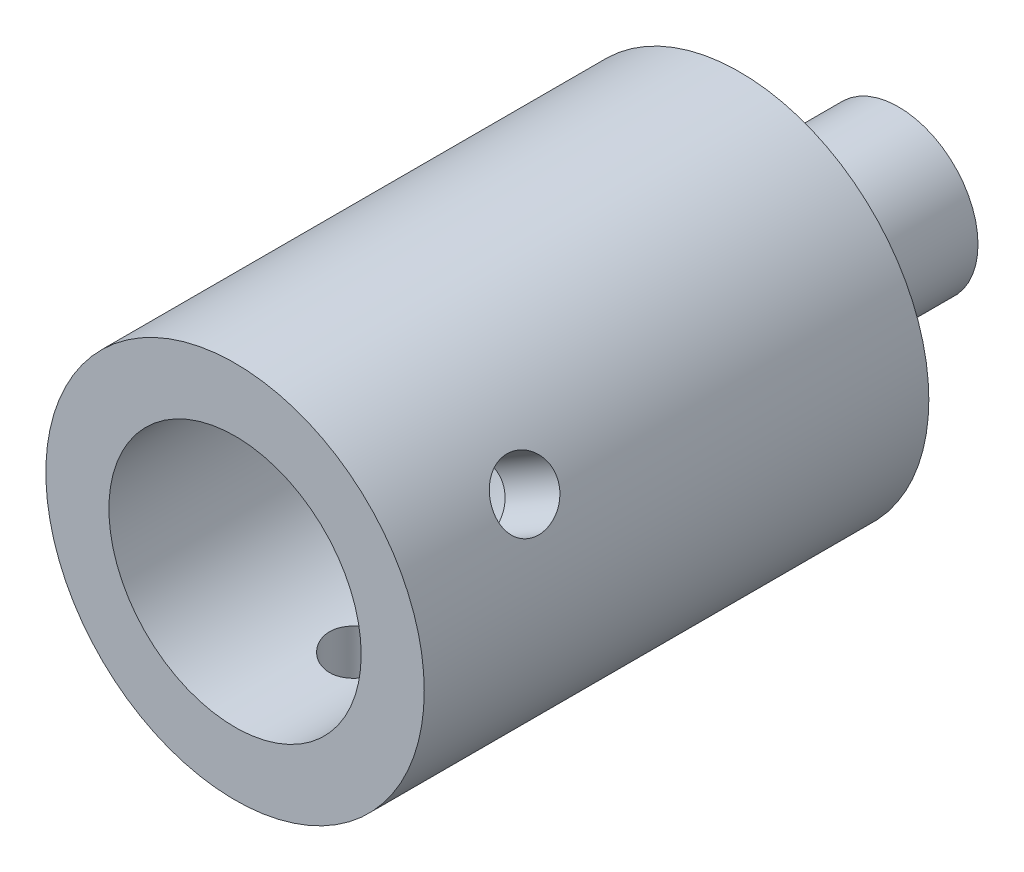
ISO-10303-21;
HEADER;
FILE_DESCRIPTION(('STEP AP214'),'2;1');
FILE_NAME('part.step','',(''),(''),'','','');
FILE_SCHEMA(('AUTOMOTIVE_DESIGN { 1 0 10303 214 1 1 1 1 }'));
ENDSEC;
DATA;
#1=APPLICATION_CONTEXT('core data for automotive mechanical design processes');
#2=APPLICATION_PROTOCOL_DEFINITION('international standard','automotive_design',2000,#1);
#3=PRODUCT_CONTEXT('',#1,'mechanical');
#4=PRODUCT('Part','Part','',(#3));
#5=PRODUCT_RELATED_PRODUCT_CATEGORY('part','',(#4));
#6=PRODUCT_DEFINITION_FORMATION('','',#4);
#7=PRODUCT_DEFINITION_CONTEXT('part definition',#1,'design');
#8=PRODUCT_DEFINITION('design','',#6,#7);
#9=PRODUCT_DEFINITION_SHAPE('','',#8);
#10=(LENGTH_UNIT() NAMED_UNIT(*) SI_UNIT(.MILLI.,.METRE.));
#11=(NAMED_UNIT(*) PLANE_ANGLE_UNIT() SI_UNIT($,.RADIAN.));
#12=(NAMED_UNIT(*) SI_UNIT($,.STERADIAN.) SOLID_ANGLE_UNIT());
#13=UNCERTAINTY_MEASURE_WITH_UNIT(LENGTH_MEASURE(1.E-05),#10,'distance_accuracy_value','');
#14=(GEOMETRIC_REPRESENTATION_CONTEXT(3) GLOBAL_UNCERTAINTY_ASSIGNED_CONTEXT((#13)) GLOBAL_UNIT_ASSIGNED_CONTEXT((#10,
#11,#12)) REPRESENTATION_CONTEXT('',''));
#15=CARTESIAN_POINT('',(0.,0.,0.));
#16=DIRECTION('',(0.,0.,1.));
#17=DIRECTION('',(1.,0.,0.));
#18=AXIS2_PLACEMENT_3D('',#15,#16,#17);
#19=CARTESIAN_POINT('',(0.,0.,7.));
#20=DIRECTION('',(0.,0.,-1.));
#21=DIRECTION('',(-1.,0.,0.));
#22=AXIS2_PLACEMENT_3D('',#19,#20,#21);
#23=CYLINDRICAL_SURFACE('',#22,4.);
#24=CARTESIAN_POINT('',(0.,0.,7.));
#25=DIRECTION('',(0.,0.,1.));
#26=DIRECTION('',(1.,0.,0.));
#27=AXIS2_PLACEMENT_3D('',#24,#25,#26);
#28=CIRCLE('',#27,4.);
#29=CARTESIAN_POINT('',(4.,0.,7.));
#30=VERTEX_POINT('',#29);
#31=EDGE_CURVE('E10',#30,#30,#28,.T.);
#32=ORIENTED_EDGE('',*,*,#31,.F.);
#33=EDGE_LOOP('',(#32));
#34=FACE_BOUND('',#33,.T.);
#35=CARTESIAN_POINT('',(0.,0.,0.));
#36=DIRECTION('',(0.,0.,1.));
#37=DIRECTION('',(1.,0.,0.));
#38=AXIS2_PLACEMENT_3D('',#35,#36,#37);
#39=CIRCLE('',#38,4.);
#40=CARTESIAN_POINT('',(4.,0.,0.));
#41=VERTEX_POINT('',#40);
#42=EDGE_CURVE('E43',#41,#41,#39,.T.);
#43=ORIENTED_EDGE('',*,*,#42,.T.);
#44=EDGE_LOOP('',(#43));
#45=FACE_BOUND('',#44,.T.);
#46=ADVANCED_FACE('F32',(#34,#45),#23,.T.);
#47=CARTESIAN_POINT('',(0.,0.,0.));
#48=DIRECTION('',(0.,0.,1.));
#49=DIRECTION('',(1.,0.,0.));
#50=AXIS2_PLACEMENT_3D('',#47,#48,#49);
#51=PLANE('',#50);
#52=ORIENTED_EDGE('',*,*,#42,.F.);
#53=EDGE_LOOP('',(#52));
#54=FACE_BOUND('',#53,.T.);
#55=ADVANCED_FACE('F118',(#54),#51,.F.);
#56=CARTESIAN_POINT('',(0.,0.,7.));
#57=DIRECTION('',(0.,0.,1.));
#58=DIRECTION('',(1.,0.,0.));
#59=AXIS2_PLACEMENT_3D('',#56,#57,#58);
#60=PLANE('',#59);
#61=CARTESIAN_POINT('',(0.,0.,7.));
#62=DIRECTION('',(0.,0.,1.));
#63=DIRECTION('',(1.,0.,0.));
#64=AXIS2_PLACEMENT_3D('',#61,#62,#63);
#65=CIRCLE('',#64,5.5);
#66=CARTESIAN_POINT('',(5.5,0.,7.));
#67=VERTEX_POINT('',#66);
#68=EDGE_CURVE('E51',#67,#67,#65,.T.);
#69=ORIENTED_EDGE('',*,*,#68,.F.);
#70=EDGE_LOOP('',(#69));
#71=FACE_BOUND('',#70,.T.);
#72=ORIENTED_EDGE('',*,*,#31,.T.);
#73=EDGE_LOOP('',(#72));
#74=FACE_BOUND('',#73,.T.);
#75=ADVANCED_FACE('F99',(#71,#74),#60,.F.);
#76=CARTESIAN_POINT('',(0.,0.,8.));
#77=DIRECTION('',(0.,0.,-1.));
#78=DIRECTION('',(-1.,0.,0.));
#79=AXIS2_PLACEMENT_3D('',#76,#77,#78);
#80=CYLINDRICAL_SURFACE('',#79,5.5);
#81=CARTESIAN_POINT('',(0.,0.,8.));
#82=DIRECTION('',(0.,0.,1.));
#83=DIRECTION('',(1.,0.,0.));
#84=AXIS2_PLACEMENT_3D('',#81,#82,#83);
#85=CIRCLE('',#84,5.5);
#86=CARTESIAN_POINT('',(5.5,0.,8.));
#87=VERTEX_POINT('',#86);
#88=EDGE_CURVE('E48',#87,#87,#85,.T.);
#89=ORIENTED_EDGE('',*,*,#88,.F.);
#90=EDGE_LOOP('',(#89));
#91=FACE_BOUND('',#90,.T.);
#92=ORIENTED_EDGE('',*,*,#68,.T.);
#93=EDGE_LOOP('',(#92));
#94=FACE_BOUND('',#93,.T.);
#95=ADVANCED_FACE('F129',(#91,#94),#80,.T.);
#96=CARTESIAN_POINT('',(0.,0.,8.));
#97=DIRECTION('',(0.,0.,1.));
#98=DIRECTION('',(1.,0.,0.));
#99=AXIS2_PLACEMENT_3D('',#96,#97,#98);
#100=PLANE('',#99);
#101=CARTESIAN_POINT('',(0.,0.,8.));
#102=DIRECTION('',(0.,0.,1.));
#103=DIRECTION('',(1.,0.,0.));
#104=AXIS2_PLACEMENT_3D('',#101,#102,#103);
#105=CIRCLE('',#104,9.525);
#106=CARTESIAN_POINT('',(9.525,0.,8.));
#107=VERTEX_POINT('',#106);
#108=EDGE_CURVE('E144',#107,#107,#105,.T.);
#109=ORIENTED_EDGE('',*,*,#108,.F.);
#110=EDGE_LOOP('',(#109));
#111=FACE_BOUND('',#110,.T.);
#112=ORIENTED_EDGE('',*,*,#88,.T.);
#113=EDGE_LOOP('',(#112));
#114=FACE_BOUND('',#113,.T.);
#115=ADVANCED_FACE('F97',(#111,#114),#100,.F.);
#116=CARTESIAN_POINT('',(0.,0.,33.4));
#117=DIRECTION('',(0.,0.,-1.));
#118=DIRECTION('',(-1.,0.,0.));
#119=AXIS2_PLACEMENT_3D('',#116,#117,#118);
#120=CYLINDRICAL_SURFACE('',#119,9.525);
#121=CARTESIAN_POINT('',(-7.3397671704804,6.07070365634315,27.05));
#122=CARTESIAN_POINT('',(-7.33977033253742,6.07070137468341,27.138503600082));
#123=CARTESIAN_POINT('',(-7.3445754385604,6.0649046536751,27.2270555298552));
#124=CARTESIAN_POINT('',(-7.36356918153057,6.04182825898946,27.4016747749723));
#125=CARTESIAN_POINT('',(-7.37776647198727,6.02453799564098,27.4877397225364));
#126=CARTESIAN_POINT('',(-7.41483371988077,5.97885650645414,27.6548325999219));
#127=CARTESIAN_POINT('',(-7.43769642884468,5.9504745580037,27.7358646739005));
#128=CARTESIAN_POINT('',(-7.49101992062327,5.88320315266951,27.8907279062458));
#129=CARTESIAN_POINT('',(-7.52147984837406,5.84431487822755,27.9645598736816));
#130=CARTESIAN_POINT('',(-7.58895019589476,5.75643526828001,28.1036636595878));
#131=CARTESIAN_POINT('',(-7.62601603702953,5.70735782459463,28.1688542084302));
#132=CARTESIAN_POINT('',(-7.70494556970601,5.60034380820746,28.2881187498572));
#133=CARTESIAN_POINT('',(-7.74680954538105,5.54240671079151,28.3421920835783));
#134=CARTESIAN_POINT('',(-7.83392365811389,5.41858106121126,28.4379922501842));
#135=CARTESIAN_POINT('',(-7.87919251789159,5.35264710528593,28.4796434499097));
#136=CARTESIAN_POINT('',(-7.97116359216357,5.21469462228451,28.5489308797869));
#137=CARTESIAN_POINT('',(-8.01786571325012,5.14267649118907,28.5765680212069));
#138=CARTESIAN_POINT('',(-8.11060378021907,4.99512270360019,28.6167942597148));
#139=CARTESIAN_POINT('',(-8.15664189612996,4.91962565126651,28.629519901663));
#140=CARTESIAN_POINT('',(-8.24700345620439,4.76659751131113,28.6399865038869));
#141=CARTESIAN_POINT('',(-8.29132701670939,4.68906656230106,28.637728482682));
#142=CARTESIAN_POINT('',(-8.37657675489082,4.53500436910733,28.6183983417796));
#143=CARTESIAN_POINT('',(-8.41753223408136,4.45847082911578,28.6014731712352));
#144=CARTESIAN_POINT('',(-8.49557927248539,4.30789439072605,28.5535205678535));
#145=CARTESIAN_POINT('',(-8.53267071397512,4.23385156825787,28.5224927055107));
#146=CARTESIAN_POINT('',(-8.60247587438793,4.09016498577646,28.4470694433998));
#147=CARTESIAN_POINT('',(-8.63516877292796,4.02054291840797,28.4026134923276));
#148=CARTESIAN_POINT('',(-8.6955551897074,3.88821848491557,28.3016403576267));
#149=CARTESIAN_POINT('',(-8.72324830298548,3.82551667946318,28.2451221978186));
#150=CARTESIAN_POINT('',(-8.77372026862784,3.70831312989371,28.1208139577967));
#151=CARTESIAN_POINT('',(-8.79643542484236,3.65392009825855,28.0528954447379));
#152=CARTESIAN_POINT('',(-8.83643731007603,3.5560937103181,27.9081471977129));
#153=CARTESIAN_POINT('',(-8.85372398902194,3.51266045510845,27.8313173815564));
#154=CARTESIAN_POINT('',(-8.88288588231045,3.4382510169371,27.6707813074078));
#155=CARTESIAN_POINT('',(-8.89475501375053,3.40728884124913,27.5870674437115));
#156=CARTESIAN_POINT('',(-8.91308271026492,3.35905549011894,27.4152208390847));
#157=CARTESIAN_POINT('',(-8.91954175174526,3.341783109177,27.3270884879654));
#158=CARTESIAN_POINT('',(-8.92703260494413,3.3217207520737,27.150033990837));
#159=CARTESIAN_POINT('',(-8.92812831416677,3.318760272504,27.0611338488892));
#160=CARTESIAN_POINT('',(-8.92507074617418,3.32697394821566,26.8840829634763));
#161=CARTESIAN_POINT('',(-8.92091767169842,3.33814755755383,26.7959321911986));
#162=CARTESIAN_POINT('',(-8.90738778555396,3.37408192338086,26.6234528729138));
#163=CARTESIAN_POINT('',(-8.89804418343364,3.39875628566325,26.5391036761775));
#164=CARTESIAN_POINT('',(-8.87412602657642,3.46072372637022,26.3759664444125));
#165=CARTESIAN_POINT('',(-8.85955115890975,3.49801755967295,26.2971787424052));
#166=CARTESIAN_POINT('',(-8.8249926609673,3.58431326542908,26.1466016325521));
#167=CARTESIAN_POINT('',(-8.80496038282067,3.63341995444791,26.0748834762999));
#168=CARTESIAN_POINT('',(-8.75958273057526,3.74149192437504,25.9412179067387));
#169=CARTESIAN_POINT('',(-8.73423698275104,3.80045789868183,25.8792711812453));
#170=CARTESIAN_POINT('',(-8.67808606314281,3.92699358708323,25.7662510481173));
#171=CARTESIAN_POINT('',(-8.64722685589621,3.99464640059104,25.7152974203093));
#172=CARTESIAN_POINT('',(-8.5805666663747,4.13589050400548,25.6265488673519));
#173=CARTESIAN_POINT('',(-8.54476584400326,4.20948160172589,25.5887535165591));
#174=CARTESIAN_POINT('',(-8.46897413203636,4.3599496640802,25.5275807791887));
#175=CARTESIAN_POINT('',(-8.42900236332594,4.43681075361013,25.5041407119083));
#176=CARTESIAN_POINT('',(-8.34561012473451,4.59174815004847,25.472142094658));
#177=CARTESIAN_POINT('',(-8.30218993892747,4.66982435643272,25.463582320205));
#178=CARTESIAN_POINT('',(-8.21360430735389,4.82391260757188,25.4616225047318));
#179=CARTESIAN_POINT('',(-8.16846634955245,4.89993819836631,25.4680402137474));
#180=CARTESIAN_POINT('',(-8.07732453399269,5.04876918342056,25.4954589906411));
#181=CARTESIAN_POINT('',(-8.03132068108442,5.12157459570965,25.5164599768586));
#182=CARTESIAN_POINT('',(-7.94003660117748,5.26198195091442,25.5723792351203));
#183=CARTESIAN_POINT('',(-7.89475562668802,5.32958958766377,25.6072820118136));
#184=CARTESIAN_POINT('',(-7.80648495249481,5.45806744609948,25.6899937895062));
#185=CARTESIAN_POINT('',(-7.76349536152267,5.5189373482116,25.7378034023137));
#186=CARTESIAN_POINT('',(-7.68096914241536,5.63323809012857,25.8456177837134));
#187=CARTESIAN_POINT('',(-7.64147772168657,5.68657570292672,25.9057560062706));
#188=CARTESIAN_POINT('',(-7.56812478582015,5.78384240490929,26.0362404755153));
#189=CARTESIAN_POINT('',(-7.53426459152374,5.82776928743931,26.1065891098961));
#190=CARTESIAN_POINT('',(-7.47344871519166,5.90556108086505,26.2560882797924));
#191=CARTESIAN_POINT('',(-7.44654356648653,5.93935262042107,26.3352975557973));
#192=CARTESIAN_POINT('',(-7.40124392822496,5.99570944693093,26.4998418648037));
#193=CARTESIAN_POINT('',(-7.38284093751907,6.01828594929884,26.5851706799121));
#194=CARTESIAN_POINT('',(-7.35942469895389,6.04687676634594,26.734026393618));
#195=CARTESIAN_POINT('',(-7.35207151958579,6.05580130455243,26.7966520230545));
#196=CARTESIAN_POINT('',(-7.34224166362754,6.06771551537862,26.9228434628732));
#197=CARTESIAN_POINT('',(-7.33976489851002,6.07070529573906,26.9864092561664));
#198=CARTESIAN_POINT('',(-7.3397671704804,6.07070365634315,27.05));
#199=B_SPLINE_CURVE_WITH_KNOTS('',3,(#121,#122,#123,#124,#125,#126,#127,#128,#129,#130,#131,
#132,#133,#134,#135,#136,#137,#138,#139,#140,#141,#142,#143,#144,#145,#146,#147,#148,#149,#150,
#151,#152,#153,#154,#155,#156,#157,#158,#159,#160,#161,#162,#163,#164,#165,#166,#167,#168,#169,
#170,#171,#172,#173,#174,#175,#176,#177,#178,#179,#180,#181,#182,#183,#184,#185,#186,#187,#188,
#189,#190,#191,#192,#193,#194,#195,#196,#197,#198),.UNSPECIFIED.,.T.,.F.,(4,2,2,2,2,2,2,2,2,2,2,
2,2,2,2,2,2,2,2,2,2,2,2,2,2,2,2,2,2,2,2,2,2,2,2,2,2,2,4),(0.,0.265278259719118,
0.530801275176487,0.796102673650743,1.06137422602349,1.32898616063879,1.59661395074874,
1.86583942370761,2.13504738795557,2.40177045345079,2.66847538854459,2.93253871939564,
3.19661009298453,3.46189048628535,3.72719235653995,3.99571288398448,4.26423588823722,
4.53305965686613,4.80185975070678,5.0674494943696,5.33302897967875,5.59692851043537,
5.8608438300642,6.12719337654316,6.39356166313487,6.66270011777466,6.93182986552703,
7.19977595105205,7.46769998654343,7.73238087928857,7.99706028993953,8.2614455029361,
8.52584325049132,8.79327043389165,9.0607602558995,9.33014217036923,9.59925414881156,
9.78986275793718,9.98046790668583),.UNSPECIFIED.);
#200=CARTESIAN_POINT('',(-7.3397671704804,6.07070365634315,27.05));
#201=VERTEX_POINT('',#200);
#202=EDGE_CURVE('E60',#201,#201,#199,.T.);
#203=ORIENTED_EDGE('',*,*,#202,.T.);
#204=EDGE_LOOP('',(#203));
#205=FACE_BOUND('',#204,.T.);
#206=CARTESIAN_POINT('',(8.92726717048046,3.32107299932744,27.05));
#207=CARTESIAN_POINT('',(8.92726677553368,3.32107687857902,27.138503600082));
#208=CARTESIAN_POINT('',(8.92464922089331,3.32813658296696,27.2270555298552));
#209=CARTESIAN_POINT('',(8.91416134835288,3.35612384423488,27.4016747749723));
#210=CARTESIAN_POINT('',(8.90628618628332,3.37706419010954,27.4877397225364));
#211=CARTESIAN_POINT('',(8.88525848011157,3.4320061130271,27.6548325999219));
#212=CARTESIAN_POINT('',(8.87211034622654,3.4659967740144,27.7358646739005));
#213=CARTESIAN_POINT('',(8.84051334614815,3.54581197518024,27.8907279062458));
#214=CARTESIAN_POINT('',(8.82206507644746,3.59163518363084,27.9645598736816));
#215=CARTESIAN_POINT('',(8.77969427551857,3.69400602355971,28.1036636595878));
#216=CARTESIAN_POINT('',(8.75572488310163,3.75064470543775,28.1688542084302));
#217=CARTESIAN_POINT('',(8.70251279268757,3.872506694038,28.2881187498572));
#218=CARTESIAN_POINT('',(8.67326978234134,3.93773050918397,28.3421920835783));
#219=CARTESIAN_POINT('',(8.60959068053116,4.07508636862888,28.4379922501842));
#220=CARTESIAN_POINT('',(8.57512462961667,4.14725732915939,28.4796434499097));
#221=CARTESIAN_POINT('',(8.50163981195829,4.29588285739298,28.5489308797869));
#222=CARTESIAN_POINT('',(8.46262134143983,4.37233714621227,28.5765680212069));
#223=CARTESIAN_POINT('',(8.38120504644773,4.52642756189968,28.6167942597148));
#224=CARTESIAN_POINT('',(8.33884173917136,4.60404626598773,28.629519901663));
#225=CARTESIAN_POINT('',(8.25149626251334,4.75881574251547,28.6399865038869));
#226=CARTESIAN_POINT('',(8.2065142713436,4.835966546404,28.637728482682));
#227=CARTESIAN_POINT('',(8.1157173673658,4.98682608193196,28.6183983417796));
#228=CARTESIAN_POINT('',(8.06991511708684,5.06056133733091,28.6014731712352));
#229=CARTESIAN_POINT('',(7.97853561543197,5.2034402744738,28.5535205678535));
#230=CARTESIAN_POINT('',(7.93295837095148,5.27258381630099,28.5224927055107));
#231=CARTESIAN_POINT('',(7.84342472054602,5.40488014977444,28.4470694433998));
#232=CARTESIAN_POINT('',(7.79947669081093,5.46800406411769,28.4026134923276));
#233=CARTESIAN_POINT('',(7.71507357825485,5.5864624518384,28.3016403576267));
#234=CARTESIAN_POINT('',(7.67461877850897,5.6417962941733,28.2451221978186));
#235=CARTESIAN_POINT('',(7.59835350998928,5.74410807338325,28.1208139577967));
#236=CARTESIAN_POINT('',(7.56260534091165,5.79097649153354,28.0528954447379));
#237=CARTESIAN_POINT('',(7.49788614641158,5.87453233431539,27.9081471977129));
#238=CARTESIAN_POINT('',(7.46891518350392,5.91121966503443,27.8313173815564));
#239=CARTESIAN_POINT('',(7.41905566641046,5.97367932453041,27.6707813074078));
#240=CARTESIAN_POINT('',(7.39817620142828,5.99943938172236,27.5870674437115));
#241=CARTESIAN_POINT('',(7.36556874229707,6.03942830806177,27.4152208390847));
#242=CARTESIAN_POINT('',(7.35383994235768,6.05365819253882,27.3270884879654));
#243=CARTESIAN_POINT('',(7.34021085804587,6.07017664025671,27.150033990837));
#244=CARTESIAN_POINT('',(7.33819486214244,6.07260579206352,27.0611338488892));
#245=CARTESIAN_POINT('',(7.34377932997089,6.06585102265231,26.8840829634763));
#246=CARTESIAN_POINT('',(7.35137942227184,6.05666754998341,26.7959321911986));
#247=CARTESIAN_POINT('',(7.37573455287469,6.02698314195848,26.6234528729138));
#248=CARTESIAN_POINT('',(7.39243137637326,6.00655416401824,26.5391036761775));
#249=CARTESIAN_POINT('',(7.43413767580439,5.95485671221469,26.3759664444125));
#250=CARTESIAN_POINT('',(7.45914764901573,5.9235875899072,26.2971787424052));
#251=CARTESIAN_POINT('',(7.51660267346682,5.85051119989434,26.1466016325521));
#252=CARTESIAN_POINT('',(7.54911417457955,5.80860939361427,26.0748834762999));
#253=CARTESIAN_POINT('',(7.62001841985077,5.71527520904208,25.9412179067387));
#254=CARTESIAN_POINT('',(7.65841157764724,5.66384216039499,25.8792711812453));
#255=CARTESIAN_POINT('',(7.73991923848409,5.55194619336771,25.7662510481173));
#256=CARTESIAN_POINT('',(7.78307868999604,5.4913949291976,25.7152974203093));
#257=CARTESIAN_POINT('',(7.87206957692695,5.36304345994367,25.6265488673519));
#258=CARTESIAN_POINT('',(7.91790092585948,5.29524348943343,25.5887535165591));
#259=CARTESIAN_POINT('',(8.01031423433309,5.15437191029662,25.5275807791887));
#260=CARTESIAN_POINT('',(8.05689200607335,5.08132479839423,25.5041407119083));
#261=CARTESIAN_POINT('',(8.14937560808945,4.93163630307643,25.472142094658));
#262=CARTESIAN_POINT('',(8.19528149334581,4.85499521593837,25.463582320205));
#263=CARTESIAN_POINT('',(8.28443301747024,4.70123368301578,25.4616225047318));
#264=CARTESIAN_POINT('',(8.32770413153522,4.62413026948757,25.4680402137474));
#265=CARTESIAN_POINT('',(8.41102463768258,4.47078364933865,25.4954589906411));
#266=CARTESIAN_POINT('',(8.4510740478038,4.39454043790358,25.5164599768586));
#267=CARTESIAN_POINT('',(8.52702834433584,4.2452824281407,25.5723792351203));
#268=CARTESIAN_POINT('',(8.56293778800588,4.17226413555003,25.6072820118136));
#269=CARTESIAN_POINT('',(8.63006754013843,4.03158056007169,25.6899937895062));
#270=CARTESIAN_POINT('',(8.66128762620733,3.96391553113545,25.7378034023137));
#271=CARTESIAN_POINT('',(8.71901186282517,3.83529535795176,25.8456177837134));
#272=CARTESIAN_POINT('',(8.7454578801212,3.77442597797,25.9057560062706));
#273=CARTESIAN_POINT('',(8.79301684704722,3.66226712107622,26.0362404755153));
#274=CARTESIAN_POINT('',(8.81412854607906,3.61097989137345,26.1065891098961));
#275=CARTESIAN_POINT('',(8.85109027722567,3.51941590080358,26.2560882797924));
#276=CARTESIAN_POINT('',(8.8669020345616,3.47921958875434,26.3352975557973));
#277=CARTESIAN_POINT('',(8.89305865886503,3.41181053798264,26.4998418648037));
#278=CARTESIAN_POINT('',(8.90340898809129,3.38458482934177,26.5851706799121));
#279=CARTESIAN_POINT('',(8.91646124268644,3.3500103633597,26.734026393618));
#280=CARTESIAN_POINT('',(8.92051352980625,3.3391800541251,26.7966520230545));
#281=CARTESIAN_POINT('',(8.92591661106866,3.32471004373662,26.9228434628732));
#282=CARTESIAN_POINT('',(8.92726745425378,3.32107021204542,26.9864092561664));
#283=CARTESIAN_POINT('',(8.92726717048046,3.32107299932744,27.05));
#284=B_SPLINE_CURVE_WITH_KNOTS('',3,(#206,#207,#208,#209,#210,#211,#212,#213,#214,#215,#216,
#217,#218,#219,#220,#221,#222,#223,#224,#225,#226,#227,#228,#229,#230,#231,#232,#233,#234,#235,
#236,#237,#238,#239,#240,#241,#242,#243,#244,#245,#246,#247,#248,#249,#250,#251,#252,#253,#254,
#255,#256,#257,#258,#259,#260,#261,#262,#263,#264,#265,#266,#267,#268,#269,#270,#271,#272,#273,
#274,#275,#276,#277,#278,#279,#280,#281,#282,#283),.UNSPECIFIED.,.T.,.F.,(4,2,2,2,2,2,2,2,2,2,2,
2,2,2,2,2,2,2,2,2,2,2,2,2,2,2,2,2,2,2,2,2,2,2,2,2,2,2,4),(0.,0.265278259719118,
0.530801275176486,0.796102673650747,1.06137422602349,1.32898616063879,1.59661395074874,
1.86583942370761,2.13504738795557,2.40177045345079,2.6684753885446,2.93253871939564,
3.19661009298453,3.46189048628535,3.72719235653995,3.99571288398448,4.26423588823722,
4.53305965686613,4.80185975070679,5.0674494943696,5.33302897967875,5.59692851043537,
5.8608438300642,6.12719337654316,6.39356166313487,6.66270011777467,6.93182986552703,
7.19977595105205,7.46769998654343,7.73238087928857,7.99706028993952,8.26144550293609,
8.52584325049132,8.79327043389165,9.0607602558995,9.33014217036923,9.59925414881156,
9.78986275793718,9.98046790668583),.UNSPECIFIED.);
#285=CARTESIAN_POINT('',(8.92726717048046,3.32107299932744,27.05));
#286=VERTEX_POINT('',#285);
#287=EDGE_CURVE('E103',#286,#286,#284,.T.);
#288=ORIENTED_EDGE('',*,*,#287,.T.);
#289=EDGE_LOOP('',(#288));
#290=FACE_BOUND('',#289,.T.);
#291=CARTESIAN_POINT('',(0.,-9.525,28.6375));
#292=CARTESIAN_POINT('',(0.0885132246484663,-9.52499848342203,28.6374964510181));
#293=CARTESIAN_POINT('',(0.177074754967651,-9.52375335474776,28.6300722303947));
#294=CARTESIAN_POINT('',(0.351713940762382,-9.51890619037781,28.600583856684));
#295=CARTESIAN_POINT('',(0.437789236154121,-9.5153019874167,28.5785062413611));
#296=CARTESIAN_POINT('',(0.604904014480028,-9.50614093330146,28.5203961901436));
#297=CARTESIAN_POINT('',(0.685947553954257,-9.50058567976088,28.4843751693182));
#298=CARTESIAN_POINT('',(0.840830069655994,-9.48813334197115,28.3994306945467));
#299=CARTESIAN_POINT('',(0.914669868572904,-9.48123641121565,28.3505087162983));
#300=CARTESIAN_POINT('',(1.05376511007522,-9.46679156586028,28.240653521774));
#301=CARTESIAN_POINT('',(1.1189416937447,-9.45923858602434,28.1796211122061));
#302=CARTESIAN_POINT('',(1.23817919664905,-9.44437168066725,28.0474910400198));
#303=CARTESIAN_POINT('',(1.29223941411327,-9.43705777026294,27.9763927424251));
#304=CARTESIAN_POINT('',(1.38802562475926,-9.42344804257461,27.8256074364649));
#305=CARTESIAN_POINT('',(1.42967364106673,-9.41715876973189,27.745870251129));
#306=CARTESIAN_POINT('',(1.49895456203612,-9.40638066519618,27.5804094266691));
#307=CARTESIAN_POINT('',(1.52658841339416,-9.40189171189085,27.4946861923647));
#308=CARTESIAN_POINT('',(1.56680812989335,-9.3952729089515,27.3205225254661));
#309=CARTESIAN_POINT('',(1.57953013350098,-9.39312172988419,27.2321143573216));
#310=CARTESIAN_POINT('',(1.58998712055907,-9.39135751224772,27.054394024179));
#311=CARTESIAN_POINT('',(1.58772316464701,-9.39174429405331,26.9650819236038));
#312=CARTESIAN_POINT('',(1.56838338748156,-9.39499282328357,26.7890608080901));
#313=CARTESIAN_POINT('',(1.55146050000001,-9.39782901557512,26.7023344497488));
#314=CARTESIAN_POINT('',(1.50352324415619,-9.4056167945899,26.5329694631785));
#315=CARTESIAN_POINT('',(1.47250839249303,-9.41056845386527,26.4503309752558));
#316=CARTESIAN_POINT('',(1.39711255126963,-9.42205684377153,26.291029697115));
#317=CARTESIAN_POINT('',(1.35266805531362,-9.42860107613151,26.2143975271384));
#318=CARTESIAN_POINT('',(1.25171963114897,-9.44253203193531,26.0696207056581));
#319=CARTESIAN_POINT('',(1.19521472961547,-9.44991882335472,26.0014767398911));
#320=CARTESIAN_POINT('',(1.070916204721,-9.46481487703664,25.8747254355123));
#321=CARTESIAN_POINT('',(1.00299136705944,-9.47232452262099,25.816246740727));
#322=CARTESIAN_POINT('',(0.858224883103348,-9.48653551886919,25.7114976207075));
#323=CARTESIAN_POINT('',(0.781383179360579,-9.49323686432489,25.6652272741337));
#324=CARTESIAN_POINT('',(0.620843256765862,-9.50508571986999,25.5861965857685));
#325=CARTESIAN_POINT('',(0.537139340733562,-9.51023192188729,25.5534476087247));
#326=CARTESIAN_POINT('',(0.365314449457736,-9.51838014413039,25.5025086733188));
#327=CARTESIAN_POINT('',(0.277193844378964,-9.52138234372551,25.4843174970217));
#328=CARTESIAN_POINT('',(0.100145787326531,-9.52488017450106,25.4631849373772));
#329=CARTESIAN_POINT('',(0.0112399680908924,-9.52540483163118,25.4600669519034));
#330=CARTESIAN_POINT('',(-0.165823755785079,-9.52396796257443,25.4686984537119));
#331=CARTESIAN_POINT('',(-0.253981689071445,-9.52200653204815,25.4804473689399));
#332=CARTESIAN_POINT('',(-0.426501671472196,-9.51583585105758,25.518332279328));
#333=CARTESIAN_POINT('',(-0.510883451424717,-9.51164026548832,25.5443808423277));
#334=CARTESIAN_POINT('',(-0.674082271886382,-9.50146984929153,25.6100324190567));
#335=CARTESIAN_POINT('',(-0.752898999602671,-9.49549491875133,25.6496361939484));
#336=CARTESIAN_POINT('',(-0.903497487812788,-9.48235667852029,25.7416784641825));
#337=CARTESIAN_POINT('',(-0.97521093434509,-9.47518333488259,25.7942272741662));
#338=CARTESIAN_POINT('',(-1.10886467679421,-9.46047426793857,25.9105161952695));
#339=CARTESIAN_POINT('',(-1.17080426220733,-9.45293851833932,25.9742571192807));
#340=CARTESIAN_POINT('',(-1.28380666508283,-9.43826011274762,26.1119129430254));
#341=CARTESIAN_POINT('',(-1.33475016330721,-9.43112233747062,26.1859263951016));
#342=CARTESIAN_POINT('',(-1.42348096703732,-9.41813921408956,26.341564135403));
#343=CARTESIAN_POINT('',(-1.46126868957884,-9.41229382501922,26.4231881822695));
#344=CARTESIAN_POINT('',(-1.52243684048545,-9.40259393098042,26.5913964803357));
#345=CARTESIAN_POINT('',(-1.54587665966794,-9.39873122987526,26.6779586403444));
#346=CARTESIAN_POINT('',(-1.5778705131492,-9.39341350190391,26.8538612820558));
#347=CARTESIAN_POINT('',(-1.58642584158582,-9.39195826572028,26.9432015215299));
#348=CARTESIAN_POINT('',(-1.58837176994007,-9.39162925508347,27.1209327803861));
#349=CARTESIAN_POINT('',(-1.58195018643949,-9.39272350881088,27.2093217403953));
#350=CARTESIAN_POINT('',(-1.5545306977376,-9.39730011223118,27.3837428225122));
#351=CARTESIAN_POINT('',(-1.53353283978142,-9.40078245418371,27.4697749522581));
#352=CARTESIAN_POINT('',(-1.47762880089276,-9.40973071238892,27.6369676076808));
#353=CARTESIAN_POINT('',(-1.44273879003128,-9.4151943218449,27.7181336713856));
#354=CARTESIAN_POINT('',(-1.3600601474866,-9.42749174265602,27.8734906499387));
#355=CARTESIAN_POINT('',(-1.31227087605534,-9.43432562196633,27.9476812185863));
#356=CARTESIAN_POINT('',(-1.20447999157632,-9.4486949331897,28.0879300952734));
#357=CARTESIAN_POINT('',(-1.14434020788197,-9.45623772690952,28.1538814706047));
#358=CARTESIAN_POINT('',(-1.01384673492645,-9.47111626449134,28.2748207688416));
#359=CARTESIAN_POINT('',(-0.943490691699522,-9.47845196016857,28.3298061580852));
#360=CARTESIAN_POINT('',(-0.793984422721576,-9.4921484632281,28.427599650307));
#361=CARTESIAN_POINT('',(-0.714776820083338,-9.49850218820721,28.4703210349637));
#362=CARTESIAN_POINT('',(-0.550235799055652,-9.50944991427127,28.5417861227273));
#363=CARTESIAN_POINT('',(-0.464908579217055,-9.51404566692701,28.5705437464856));
#364=CARTESIAN_POINT('',(-0.316041601878829,-9.51995677178927,28.6070233490704));
#365=CARTESIAN_POINT('',(-0.253402357239514,-9.52183787318583,28.6184337882061));
#366=CARTESIAN_POINT('',(-0.127183712053079,-9.52436002151187,28.6336733235314));
#367=CARTESIAN_POINT('',(-0.0636043277113938,-9.52500108979108,28.6375025502472));
#368=CARTESIAN_POINT('',(0.,-9.525,28.6375));
#369=B_SPLINE_CURVE_WITH_KNOTS('',3,(#291,#292,#293,#294,#295,#296,#297,#298,#299,#300,#301,
#302,#303,#304,#305,#306,#307,#308,#309,#310,#311,#312,#313,#314,#315,#316,#317,#318,#319,#320,
#321,#322,#323,#324,#325,#326,#327,#328,#329,#330,#331,#332,#333,#334,#335,#336,#337,#338,#339,
#340,#341,#342,#343,#344,#345,#346,#347,#348,#349,#350,#351,#352,#353,#354,#355,#356,#357,#358,
#359,#360,#361,#362,#363,#364,#365,#366,#367,#368),.UNSPECIFIED.,.T.,.F.,(4,2,2,2,2,2,2,2,2,2,2,
2,2,2,2,2,2,2,2,2,2,2,2,2,2,2,2,2,2,2,2,2,2,2,2,2,2,2,4),(0.,0.265307181435953,
0.530858441516592,0.796192760561046,1.06149674204849,1.32907081824581,1.59666178107859,
1.86590000723138,2.13512004316375,2.40186258960674,2.66858625743763,2.93256031317859,
3.19654342291117,3.46179493461674,3.72706786132163,3.99562808893691,4.26419004688763,
4.53297727461598,4.80174201270929,5.06735006017037,5.3329478877777,5.59693957449074,
5.86094608749552,6.1272853427316,6.39364395039469,6.66276176974838,6.93187105733723,
7.19985874187025,7.46782312494502,7.73244522546915,7.99706646829464,8.26138059573651,
8.52570783443628,8.79317128962803,9.06069647013147,9.33006917070571,9.59917277602595,
9.78982197584151,9.98046789320874),.UNSPECIFIED.);
#370=CARTESIAN_POINT('',(0.,-9.525,28.6375));
#371=VERTEX_POINT('',#370);
#372=EDGE_CURVE('E59',#371,#371,#369,.T.);
#373=ORIENTED_EDGE('',*,*,#372,.T.);
#374=EDGE_LOOP('',(#373));
#375=FACE_BOUND('',#374,.T.);
#376=CARTESIAN_POINT('',(0.,0.,33.4));
#377=DIRECTION('',(0.,0.,1.));
#378=DIRECTION('',(1.,0.,0.));
#379=AXIS2_PLACEMENT_3D('',#376,#377,#378);
#380=CIRCLE('',#379,9.525);
#381=CARTESIAN_POINT('',(9.525,0.,33.4));
#382=VERTEX_POINT('',#381);
#383=EDGE_CURVE('E142',#382,#382,#380,.T.);
#384=ORIENTED_EDGE('',*,*,#383,.F.);
#385=EDGE_LOOP('',(#384));
#386=FACE_BOUND('',#385,.T.);
#387=ORIENTED_EDGE('',*,*,#108,.T.);
#388=EDGE_LOOP('',(#387));
#389=FACE_BOUND('',#388,.T.);
#390=ADVANCED_FACE('F91',(#205,#290,#375,#386,#389),#120,.T.);
#391=CARTESIAN_POINT('',(0.,0.,33.4));
#392=DIRECTION('',(0.,0.,1.));
#393=DIRECTION('',(1.,0.,0.));
#394=AXIS2_PLACEMENT_3D('',#391,#392,#393);
#395=PLANE('',#394);
#396=CARTESIAN_POINT('',(0.,0.,33.4));
#397=DIRECTION('',(0.,0.,1.));
#398=DIRECTION('',(1.,0.,0.));
#399=AXIS2_PLACEMENT_3D('',#396,#397,#398);
#400=CIRCLE('',#399,6.35);
#401=CARTESIAN_POINT('',(6.35,0.,33.4));
#402=VERTEX_POINT('',#401);
#403=EDGE_CURVE('E85',#402,#402,#400,.T.);
#404=ORIENTED_EDGE('',*,*,#403,.F.);
#405=EDGE_LOOP('',(#404));
#406=FACE_BOUND('',#405,.T.);
#407=ORIENTED_EDGE('',*,*,#383,.T.);
#408=EDGE_LOOP('',(#407));
#409=FACE_BOUND('',#408,.T.);
#410=ADVANCED_FACE('F96',(#406,#409),#395,.T.);
#411=CARTESIAN_POINT('',(0.,0.,14.35));
#412=DIRECTION('',(0.,0.,1.));
#413=DIRECTION('',(1.,0.,0.));
#414=AXIS2_PLACEMENT_3D('',#411,#412,#413);
#415=CYLINDRICAL_SURFACE('',#414,6.35);
#416=CARTESIAN_POINT('',(-4.53088687142134,4.44899585955995,27.05));
#417=CARTESIAN_POINT('',(-4.53088956570778,4.44899453979381,26.9623377731629));
#418=CARTESIAN_POINT('',(-4.53617115004208,4.44363378267565,26.8746479893395));
#419=CARTESIAN_POINT('',(-4.5569840934686,4.42228566814344,26.7017865878595));
#420=CARTESIAN_POINT('',(-4.57252141783885,4.40629212610324,26.6166164659126));
#421=CARTESIAN_POINT('',(-4.61290598094747,4.36399427282939,26.4513197532512));
#422=CARTESIAN_POINT('',(-4.63774119996734,4.3377032714693,26.3711868063301));
#423=CARTESIAN_POINT('',(-4.69537539895192,4.27524828717214,26.2179526086372));
#424=CARTESIAN_POINT('',(-4.72817471701704,4.23908388507085,26.1448516565791));
#425=CARTESIAN_POINT('',(-4.80083359458634,4.15662939320918,26.0061478552585));
#426=CARTESIAN_POINT('',(-4.84082033026771,4.11015262747644,25.9407225637777));
#427=CARTESIAN_POINT('',(-4.92551865887988,4.00825994823579,25.8207915145812));
#428=CARTESIAN_POINT('',(-4.97023069294027,3.95284319988232,25.7662867777302));
#429=CARTESIAN_POINT('',(-5.06307565607938,3.83321899821676,25.6690175780541));
#430=CARTESIAN_POINT('',(-5.11124761289684,3.76889967438505,25.6264275435175));
#431=CARTESIAN_POINT('',(-5.20840485512028,3.63344947600325,25.5553308759628));
#432=CARTESIAN_POINT('',(-5.25739001942191,3.56231960830189,25.5268221650336));
#433=CARTESIAN_POINT('',(-5.35325424309379,3.41652210249976,25.4852661250426));
#434=CARTESIAN_POINT('',(-5.40015586511032,3.34195532466064,25.4719172758526));
#435=CARTESIAN_POINT('',(-5.49125786236872,3.19005103007798,25.46011342916));
#436=CARTESIAN_POINT('',(-5.53545863600914,3.11271392466439,25.4616562296469));
#437=CARTESIAN_POINT('',(-5.61893217140866,2.95931780074677,25.4793750299088));
#438=CARTESIAN_POINT('',(-5.65829252003301,2.88326850094499,25.4952255664092));
#439=CARTESIAN_POINT('',(-5.73237787162932,2.73301390202012,25.5405867564808));
#440=CARTESIAN_POINT('',(-5.76710262772331,2.65880870127945,25.5700981372147));
#441=CARTESIAN_POINT('',(-5.83176414671306,2.5138395733358,25.6422066323863));
#442=CARTESIAN_POINT('',(-5.86165481288496,2.4431127977798,25.6849195733602));
#443=CARTESIAN_POINT('',(-5.91615798869497,2.30800555635837,25.7821308562388));
#444=CARTESIAN_POINT('',(-5.94076957856793,2.24362619744743,25.836631248536));
#445=CARTESIAN_POINT('',(-5.98544466910343,2.12162489209349,25.9576150511588));
#446=CARTESIAN_POINT('',(-6.00536704928874,2.06423299051108,26.0243828566408));
#447=CARTESIAN_POINT('',(-6.04008521790399,1.96032657320674,26.1670959831981));
#448=CARTESIAN_POINT('',(-6.05488076673373,1.91381256589141,26.2430417329768));
#449=CARTESIAN_POINT('',(-6.07975668405438,1.83326283532328,26.4024841716846));
#450=CARTESIAN_POINT('',(-6.08981384122976,1.79928871167053,26.4860156887489));
#451=CARTESIAN_POINT('',(-6.10541761912229,1.74561321203145,26.6579417722285));
#452=CARTESIAN_POINT('',(-6.11096520509054,1.72590878178742,26.7463352936293));
#453=CARTESIAN_POINT('',(-6.11766505797713,1.70200631759192,26.9229742834672));
#454=CARTESIAN_POINT('',(-6.11892954477904,1.69741247199774,27.0111619987643));
#455=CARTESIAN_POINT('',(-6.11742419949139,1.70282973723876,27.1870469297271));
#456=CARTESIAN_POINT('',(-6.11465473877538,1.71283950363534,27.274744189799));
#457=CARTESIAN_POINT('',(-6.10506114412629,1.74671885588161,27.4456775582462));
#458=CARTESIAN_POINT('',(-6.09830409226224,1.77035899417318,27.5289631813725));
#459=CARTESIAN_POINT('',(-6.08057365396808,1.83032661420378,27.6903539757358));
#460=CARTESIAN_POINT('',(-6.06959976806231,1.8666555988652,27.7684585320001));
#461=CARTESIAN_POINT('',(-6.04288115679596,1.95143375341326,27.9189602114458));
#462=CARTESIAN_POINT('',(-6.0270470640476,2.00010670676509,27.9912153134274));
#463=CARTESIAN_POINT('',(-5.99035949735338,2.10743994999199,28.1264446103789));
#464=CARTESIAN_POINT('',(-5.96950519835715,2.16610188105048,28.1894172770728));
#465=CARTESIAN_POINT('',(-5.92192678389941,2.29302895008467,28.3059100120326));
#466=CARTESIAN_POINT('',(-5.89506885443575,2.36149764618574,28.3591541397185));
#467=CARTESIAN_POINT('',(-5.83571510878484,2.50457958408174,28.452674275514));
#468=CARTESIAN_POINT('',(-5.80321958680824,2.57919250511957,28.4929509600462));
#469=CARTESIAN_POINT('',(-5.73307351134894,2.73154586469292,28.5590432319252));
#470=CARTESIAN_POINT('',(-5.69546255739024,2.80925931927854,28.5849628205807));
#471=CARTESIAN_POINT('',(-5.6155385040362,2.96579522527648,28.6219173124763));
#472=CARTESIAN_POINT('',(-5.57322631381084,3.04461745969611,28.6329550882993));
#473=CARTESIAN_POINT('',(-5.48617103118678,3.19875791370172,28.6396710484512));
#474=CARTESIAN_POINT('',(-5.44152460022401,3.27411325121634,28.6357564631889));
#475=CARTESIAN_POINT('',(-5.35015763090414,3.42137736729489,28.6136115741702));
#476=CARTESIAN_POINT('',(-5.30343715427046,3.49328624829282,28.5953816961667));
#477=CARTESIAN_POINT('',(-5.20980286853234,3.63144422739722,28.5453421011137));
#478=CARTESIAN_POINT('',(-5.16289145420838,3.69772171030756,28.513606017863));
#479=CARTESIAN_POINT('',(-5.0703691081016,3.82360651464028,28.4375217058068));
#480=CARTESIAN_POINT('',(-5.02475834105319,3.88321299391348,28.3931718871371));
#481=CARTESIAN_POINT('',(-4.93558225197805,3.99597595202112,28.2918770660296));
#482=CARTESIAN_POINT('',(-4.89209211110186,4.04894369628784,28.2346557731345));
#483=CARTESIAN_POINT('',(-4.81027001044592,4.14582105122321,28.1097787224916));
#484=CARTESIAN_POINT('',(-4.77193936110442,4.18972836217301,28.0421203231946));
#485=CARTESIAN_POINT('',(-4.70161975296152,4.2685030685736,27.8967702549554));
#486=CARTESIAN_POINT('',(-4.66976244507397,4.30318653427864,27.8189149540824));
#487=CARTESIAN_POINT('',(-4.61505627668272,4.3618086377279,27.6563369097477));
#488=CARTESIAN_POINT('',(-4.59220086302609,4.38575509350997,27.5716192163055));
#489=CARTESIAN_POINT('',(-4.56017442654428,4.41901930433714,27.4142089937251));
#490=CARTESIAN_POINT('',(-4.54923354972405,4.43024640664837,27.3422696015406));
#491=CARTESIAN_POINT('',(-4.53458895199972,4.44523491878787,27.1968931704626));
#492=CARTESIAN_POINT('',(-4.53088461375334,4.44899696545342,27.123456259861));
#493=CARTESIAN_POINT('',(-4.53088687142134,4.44899585955995,27.05));
#494=B_SPLINE_CURVE_WITH_KNOTS('',3,(#416,#417,#418,#419,#420,#421,#422,#423,#424,#425,#426,
#427,#428,#429,#430,#431,#432,#433,#434,#435,#436,#437,#438,#439,#440,#441,#442,#443,#444,#445,
#446,#447,#448,#449,#450,#451,#452,#453,#454,#455,#456,#457,#458,#459,#460,#461,#462,#463,#464,
#465,#466,#467,#468,#469,#470,#471,#472,#473,#474,#475,#476,#477,#478,#479,#480,#481,#482,#483,
#484,#485,#486,#487,#488,#489,#490,#491,#492,#493),.UNSPECIFIED.,.T.,.F.,(4,2,2,2,2,2,2,2,2,2,2,
2,2,2,2,2,2,2,2,2,2,2,2,2,2,2,2,2,2,2,2,2,2,2,2,2,2,2,4),(0.,0.262716925502443,
0.525586795807202,0.78811801175042,1.05066037489728,1.3184121091254,1.58618886139715,
1.85770200212679,2.12917506502904,2.39514856882045,2.66108274402923,2.92111596807481,
3.18116303520239,3.44355975151572,3.7060021477276,3.97554746273164,4.24510537311874,
4.51597034325335,4.78677732082262,5.0504316997369,5.31406180761714,5.57337852180846,
5.832725961026,6.09716107120565,6.36163966992003,6.63273585162977,6.90381788981916,
7.172909662324,7.44194948557239,7.70371488290934,7.96547249534382,8.22582096615416,
8.48620226643676,8.75282156329615,9.01950845044098,9.2911706307577,9.56263468067803,
9.78279620257604,10.002938941882),.UNSPECIFIED.);
#495=CARTESIAN_POINT('',(-4.53088687142134,4.44899585955995,27.05));
#496=VERTEX_POINT('',#495);
#497=EDGE_CURVE('E35',#496,#496,#494,.T.);
#498=ORIENTED_EDGE('',*,*,#497,.T.);
#499=EDGE_LOOP('',(#498));
#500=FACE_BOUND('',#499,.T.);
#501=CARTESIAN_POINT('',(6.11838687142139,1.69936520254428,27.05));
#502=CARTESIAN_POINT('',(6.1183870756136,1.69936819574785,26.9623377731629));
#503=CARTESIAN_POINT('',(6.1163853159329,1.70662256051266,26.8746479893395));
#504=CARTESIAN_POINT('',(6.10830377813836,1.73532115551366,26.7017865878595));
#505=CARTESIAN_POINT('',(6.10222162662019,1.75677364414524,26.6166164659126));
#506=CARTESIAN_POINT('',(6.0857828927138,1.81289662835497,26.4513197532512));
#507=CARTESIAN_POINT('',(6.07543182715496,1.84755005961476,26.3711868063301));
#508=CARTESIAN_POINT('',(6.05016132365295,1.92869023221076,26.2179526086371));
#509=CARTESIAN_POINT('',(6.03524169175312,1.97517747593261,26.1448516565791));
#510=CARTESIAN_POINT('',(6.00016344592942,2.07932915564892,26.0061478552585));
#511=CARTESIAN_POINT('',(5.97990675395982,2.13719706742977,25.9407225637777));
#512=CARTESIAN_POINT('',(5.93401426958385,2.26149431128632,25.8207915145812));
#513=CARTESIAN_POINT('',(5.9083779747448,2.32792444281422,25.7662867777302));
#514=CARTESIAN_POINT('',(5.85120285876456,2.4681426403389,25.6690175780541));
#515=CARTESIAN_POINT('',(5.81958666878078,2.54202044060868,25.6264275435175));
#516=CARTESIAN_POINT('',(5.75086197714622,2.69388617972672,25.5553308759628));
#517=CARTESIAN_POINT('',(5.71375428689984,2.77187351027117,25.5268221650336));
#518=CARTESIAN_POINT('',(5.63542205490273,2.92779311618615,25.4852661250426));
#519=CARTESIAN_POINT('',(5.59429614202396,3.00569450125072,25.4719172758526));
#520=CARTESIAN_POINT('',(5.50829416260063,3.16054329250333,25.46011342916));
#521=CARTESIAN_POINT('',(5.46341865147751,3.23749083804965,25.4616562296469));
#522=CARTESIAN_POINT('',(5.37231047902255,3.38647910220815,25.4793750299088));
#523=CARTESIAN_POINT('',(5.32613002776636,3.45859081391953,25.4952255664092));
#524=CARTESIAN_POINT('',(5.23304840386014,3.59787790991268,25.5405867564808));
#525=CARTESIAN_POINT('',(5.18614719297279,3.66505303120063,25.5700981372147));
#526=CARTESIAN_POINT('',(5.09293100490399,3.79353611326486,25.6422066323863));
#527=CARTESIAN_POINT('',(5.04662515363068,3.85478557728377,25.6849195733602));
#528=CARTESIAN_POINT('',(4.95687043822949,3.96954033283288,25.7821308562388));
#529=CARTESIAN_POINT('',(4.91342207286974,4.02304427434586,25.836631248536));
#530=CARTESIAN_POINT('',(4.83010338840611,4.12273469034295,25.9576150511588));
#531=CARTESIAN_POINT('',(4.79036173375691,4.16868392847848,26.0243828566408));
#532=CARTESIAN_POINT('',(4.71773522106275,4.25070395312433,26.1670959831981));
#533=CARTESIAN_POINT('',(4.68485068351073,4.28677427793148,26.2430417329768));
#534=CARTESIAN_POINT('',(4.62753052923106,4.34859231955768,26.4024841716846));
#535=CARTESIAN_POINT('',(4.60313665366416,4.37428913498778,26.4860156887489));
#536=CARTESIAN_POINT('',(4.56445419636215,4.41464015285726,26.6579417722285));
#537=CARTESIAN_POINT('',(4.55016345218784,4.42929671835746,26.7463352936293));
#538=CARTESIAN_POINT('',(4.53281323742479,4.44705019325661,26.9229742834672));
#539=CARTESIAN_POINT('',(4.52946709384013,4.45044219374691,27.0111619987643));
#540=CARTESIAN_POINT('',(4.53340591051407,4.44642989386582,27.1870469297271));
#541=CARTESIAN_POINT('',(4.54068989214144,4.43902658733269,27.274744189799));
#542=CARTESIAN_POINT('',(4.56523347452593,4.41377861452984,27.4456775582462));
#543=CARTESIAN_POINT('',(4.58232790890338,4.39610676681509,27.5289631813725));
#544=CARTESIAN_POINT('',(4.62539617210729,4.35076794681682,27.6903539757358));
#545=CARTESIAN_POINT('',(4.6513710527649,4.32309979051348,27.7684585320001));
#546=CARTESIAN_POINT('',(4.7114317826563,4.25757171712895,27.9189602114458));
#547=CARTESIAN_POINT('',(4.74566675036202,4.21952251388707,27.9912153134274));
#548=CARTESIAN_POINT('',(4.82027628231998,4.13408352751339,28.1264446103789));
#549=CARTESIAN_POINT('',(4.86065185535356,4.0866922092753,28.1894172770728));
#550=CARTESIAN_POINT('',(4.94678471433621,3.98202455916601,28.3059100120326));
#551=CARTESIAN_POINT('',(4.9926513797919,3.9245305619069,28.3591541397185));
#552=CARTESIAN_POINT('',(5.08688710000709,3.80158774141545,28.452674275514));
#553=CARTESIAN_POINT('',(5.13525602408811,3.73613933335556,28.4929509600462));
#554=CARTESIAN_POINT('',(5.23212486610088,3.59921437024536,28.5590432319252));
#555=CARTESIAN_POINT('',(5.28062121500853,3.52778560136375,28.5849628205807));
#556=CARTESIAN_POINT('',(5.37622325953014,3.38030138778675,28.6219173124763));
#557=CARTESIAN_POINT('',(5.42332922180791,3.30424683895201,28.6329550882993));
#558=CARTESIAN_POINT('',(5.5132911294156,3.15178452566313,28.6396710484512));
#559=CARTESIAN_POINT('',(5.55622755053264,3.07544191350376,28.6357564631889));
#560=CARTESIAN_POINT('',(5.63807853146258,2.92268373896668,28.6136115741702));
#561=CARTESIAN_POINT('',(5.67699321084766,2.84626817882603,28.5953816961667));
#562=CARTESIAN_POINT('',(5.74982438761853,2.69609951915941,28.5453421011136));
#563=CARTESIAN_POINT('',(5.78376666435579,2.62233430117224,28.513606017863));
#564=CARTESIAN_POINT('',(5.84652492980497,2.47926519685966,28.4375217058068));
#565=CARTESIAN_POINT('',(5.8753402715615,2.40996187427306,28.3931718871371));
#566=CARTESIAN_POINT('',(5.92840781335103,2.27635163667001,28.2918770660296));
#567=CARTESIAN_POINT('',(5.95253415502907,2.21220419772371,28.2346557731345));
#568=CARTESIAN_POINT('',(5.99552135512658,2.09290550249697,28.1097787224916));
#569=CARTESIAN_POINT('',(6.01438087715021,2.03775653094879,28.0421203231946));
#570=CARTESIAN_POINT('',(6.04744196999733,1.93747061071257,27.8967702549554));
#571=CARTESIAN_POINT('',(6.06155007844541,1.89253963993325,27.8189149540824));
#572=CARTESIAN_POINT('',(6.08496522506013,1.81585165663808,27.6563369097477));
#573=CARTESIAN_POINT('',(6.09427575726968,1.78408505990641,27.5716192163055));
#574=CARTESIAN_POINT('',(6.10707019064195,1.73971724690688,27.4142089937251));
#575=CARTESIAN_POINT('',(6.11132270804425,1.72462861848527,27.3422696015406));
#576=CARTESIAN_POINT('',(6.11698084145982,1.70445176875805,27.1968931704626));
#577=CARTESIAN_POINT('',(6.11838670031922,1.6993626943997,27.123456259861));
#578=CARTESIAN_POINT('',(6.11838687142139,1.69936520254428,27.05));
#579=B_SPLINE_CURVE_WITH_KNOTS('',3,(#501,#502,#503,#504,#505,#506,#507,#508,#509,#510,#511,
#512,#513,#514,#515,#516,#517,#518,#519,#520,#521,#522,#523,#524,#525,#526,#527,#528,#529,#530,
#531,#532,#533,#534,#535,#536,#537,#538,#539,#540,#541,#542,#543,#544,#545,#546,#547,#548,#549,
#550,#551,#552,#553,#554,#555,#556,#557,#558,#559,#560,#561,#562,#563,#564,#565,#566,#567,#568,
#569,#570,#571,#572,#573,#574,#575,#576,#577,#578),.UNSPECIFIED.,.T.,.F.,(4,2,2,2,2,2,2,2,2,2,2,
2,2,2,2,2,2,2,2,2,2,2,2,2,2,2,2,2,2,2,2,2,2,2,2,2,2,2,4),(0.,0.262716925502446,
0.525586795807202,0.788118011750423,1.05066037489729,1.3184121091254,1.58618886139715,
1.85770200212679,2.12917506502904,2.39514856882045,2.66108274402923,2.92111596807481,
3.18116303520239,3.44355975151572,3.7060021477276,3.97554746273164,4.24510537311874,
4.51597034325335,4.78677732082262,5.0504316997369,5.31406180761714,5.57337852180846,
5.832725961026,6.09716107120565,6.36163966992003,6.63273585162977,6.90381788981916,
7.17290966232399,7.44194948557239,7.70371488290935,7.96547249534382,8.22582096615416,
8.48620226643675,8.75282156329614,9.01950845044097,9.29117063075769,9.56263468067802,
9.78279620257603,10.0029389418819),.UNSPECIFIED.);
#580=CARTESIAN_POINT('',(6.11838687142139,1.69936520254428,27.05));
#581=VERTEX_POINT('',#580);
#582=EDGE_CURVE('E61',#581,#581,#579,.T.);
#583=ORIENTED_EDGE('',*,*,#582,.T.);
#584=EDGE_LOOP('',(#583));
#585=FACE_BOUND('',#584,.T.);
#586=CARTESIAN_POINT('',(0.,-6.34999999999999,28.6375));
#587=CARTESIAN_POINT('',(-0.0877105271754655,-6.34999851693646,28.6374975385938));
#588=CARTESIAN_POINT('',(-0.175448550370891,-6.34816461856185,28.6302064420977));
#589=CARTESIAN_POINT('',(-0.34841002599048,-6.34102653803303,28.6012783815334));
#590=CARTESIAN_POINT('',(-0.433632024604865,-6.335720389028,28.5796332865724));
#591=CARTESIAN_POINT('',(-0.599038756393226,-6.32222537868075,28.5227351234193));
#592=CARTESIAN_POINT('',(-0.679229404630085,-6.31403998007875,28.4874983963597));
#593=CARTESIAN_POINT('',(-0.83256133959885,-6.29565822196369,28.4044746955359));
#594=CARTESIAN_POINT('',(-0.905702388435769,-6.28546179462203,28.3566872984408));
#595=CARTESIAN_POINT('',(-1.04436537306014,-6.2639301271799,28.2488791642826));
#596=CARTESIAN_POINT('',(-1.10972143864797,-6.25257731732197,28.1886485831682));
#597=CARTESIAN_POINT('',(-1.22951761462349,-6.23012914624385,28.0581130831381));
#598=CARTESIAN_POINT('',(-1.28395649243783,-6.21903381421835,27.987807028215));
#599=CARTESIAN_POINT('',(-1.38115309112898,-6.1981797094886,27.8378283850362));
#600=CARTESIAN_POINT('',(-1.42372526185433,-6.18844324148057,27.758032164059));
#601=CARTESIAN_POINT('',(-1.49478672821597,-6.17166548676269,27.5921329309949));
#602=CARTESIAN_POINT('',(-1.52327827533996,-6.16462376920368,27.5060309297302));
#603=CARTESIAN_POINT('',(-1.56480386895121,-6.15421337859408,27.331788131069));
#604=CARTESIAN_POINT('',(-1.57813615065278,-6.15077394721492,27.243722735014));
#605=CARTESIAN_POINT('',(-1.58989371194681,-6.14774575352442,27.0665432644602));
#606=CARTESIAN_POINT('',(-1.58832141675736,-6.14815636474815,26.9774293629273));
#607=CARTESIAN_POINT('',(-1.57055240524324,-6.15271825817254,26.8029682701371));
#608=CARTESIAN_POINT('',(-1.55471107670163,-6.15677863343656,26.7175821339494));
#609=CARTESIAN_POINT('',(-1.50942059780579,-6.16803767740945,26.5507195544522));
#610=CARTESIAN_POINT('',(-1.47997047802347,-6.17523656968987,26.4692433901277));
#611=CARTESIAN_POINT('',(-1.40799553081682,-6.19204495548597,26.3115605994666));
#612=CARTESIAN_POINT('',(-1.3653417228215,-6.20167804905137,26.2354154681894));
#613=CARTESIAN_POINT('',(-1.26826039211583,-6.22225610645758,26.091236032174));
#614=CARTESIAN_POINT('',(-1.21383080915602,-6.23320129970928,26.0232031499622));
#615=CARTESIAN_POINT('',(-1.09290212445429,-6.25555306904602,25.8951428400568));
#616=CARTESIAN_POINT('',(-1.02610312322554,-6.2669639019752,25.8353989980184));
#617=CARTESIAN_POINT('',(-0.883297612691416,-6.28867980237548,25.7279075183924));
#618=CARTESIAN_POINT('',(-0.807290822240907,-6.29898483606464,25.6801602472377));
#619=CARTESIAN_POINT('',(-0.647822648854472,-6.3173793313301,25.5979131295792));
#620=CARTESIAN_POINT('',(-0.564336557812459,-6.32546106135176,25.5634593482307));
#621=CARTESIAN_POINT('',(-0.392510441951217,-6.33844212149251,25.5091541847907));
#622=CARTESIAN_POINT('',(-0.304171349100929,-6.34334206034072,25.4893000094575));
#623=CARTESIAN_POINT('',(-0.127571468662778,-6.34931736728871,25.4651907431169));
#624=CARTESIAN_POINT('',(-0.0393665286541889,-6.35048739962928,25.4605494640703));
#625=CARTESIAN_POINT('',(0.136559792498262,-6.34914068428627,25.4659385271754));
#626=CARTESIAN_POINT('',(0.224281216457196,-6.34662426847621,25.4759675486291));
#627=CARTESIAN_POINT('',(0.39540843445512,-6.33824806693119,25.5100942113809));
#628=CARTESIAN_POINT('',(0.478858917575265,-6.3324383784665,25.5339811705131));
#629=CARTESIAN_POINT('',(0.640563967845574,-6.31813047854458,25.5949049972634));
#630=CARTESIAN_POINT('',(0.718818009309537,-6.30963199558136,25.6319431928981));
#631=CARTESIAN_POINT('',(0.869445317271587,-6.29066250888678,25.7188665697258));
#632=CARTESIAN_POINT('',(0.941689592609586,-6.28015917963337,25.7689680522866));
#633=CARTESIAN_POINT('',(1.07688233277243,-6.25839605556685,25.8803193201435));
#634=CARTESIAN_POINT('',(1.1398291899131,-6.24713613041388,25.9415710294279));
#635=CARTESIAN_POINT('',(1.25623168454364,-6.22478812783483,26.0752770752271));
#636=CARTESIAN_POINT('',(1.30941642656665,-6.21371105264872,26.1479694856776));
#637=CARTESIAN_POINT('',(1.4028322199551,-6.19329129615911,26.3014753714762));
#638=CARTESIAN_POINT('',(1.44306384631715,-6.18394853787602,26.3822884861324));
#639=CARTESIAN_POINT('',(1.50913192014483,-6.1681581692752,26.5493085562205));
#640=CARTESIAN_POINT('',(1.53505365312555,-6.16169345183933,26.6354800733307));
#641=CARTESIAN_POINT('',(1.57199082345108,-6.15237470828778,26.811144366766));
#642=CARTESIAN_POINT('',(1.58300952074824,-6.14951989253599,26.9006364123427));
#643=CARTESIAN_POINT('',(1.58965750810348,-6.14780437107521,27.0776447502468));
#644=CARTESIAN_POINT('',(1.58571977515062,-6.14883128804079,27.1651439521737));
#645=CARTESIAN_POINT('',(1.56355761954778,-6.15450370366634,27.3381882821736));
#646=CARTESIAN_POINT('',(1.54533348401016,-6.15914912960548,27.4237334494811));
#647=CARTESIAN_POINT('',(1.49535231307696,-6.17147250889215,27.5899706191776));
#648=CARTESIAN_POINT('',(1.46367648662006,-6.17913224458427,27.6706884813792));
#649=CARTESIAN_POINT('',(1.3877553668987,-6.19662374808777,27.8257216967053));
#650=CARTESIAN_POINT('',(1.34350833028618,-6.20645581711151,27.9000361599562));
#651=CARTESIAN_POINT('',(1.24234336730763,-6.22750462928884,28.0422453156938));
#652=CARTESIAN_POINT('',(1.18512501408213,-6.23875080280276,28.1099219693737));
#653=CARTESIAN_POINT('',(1.06022708450914,-6.26118495502319,28.2348539557418));
#654=CARTESIAN_POINT('',(0.99254502750138,-6.27237291927805,28.2921068102029));
#655=CARTESIAN_POINT('',(0.847161529260242,-6.29367185560443,28.3955769682309));
#656=CARTESIAN_POINT('',(0.769300830284844,-6.3037596531221,28.4415756328024));
#657=CARTESIAN_POINT('',(0.606706579648588,-6.32147712265334,28.5197577316121));
#658=CARTESIAN_POINT('',(0.521978004637217,-6.32910855503102,28.5519510650197));
#659=CARTESIAN_POINT('',(0.364500851349342,-6.33992529706865,28.5968301870989));
#660=CARTESIAN_POINT('',(0.292502347544373,-6.34367735847431,28.6120483988982));
#661=CARTESIAN_POINT('',(0.147008925709234,-6.34871523870478,28.6323839569999));
#662=CARTESIAN_POINT('',(0.0735141206484359,-6.35000124302196,28.6375020630148));
#663=CARTESIAN_POINT('',(0.,-6.34999999999999,28.6375));
#664=B_SPLINE_CURVE_WITH_KNOTS('',3,(#586,#587,#588,#589,#590,#591,#592,#593,#594,#595,#596,
#597,#598,#599,#600,#601,#602,#603,#604,#605,#606,#607,#608,#609,#610,#611,#612,#613,#614,#615,
#616,#617,#618,#619,#620,#621,#622,#623,#624,#625,#626,#627,#628,#629,#630,#631,#632,#633,#634,
#635,#636,#637,#638,#639,#640,#641,#642,#643,#644,#645,#646,#647,#648,#649,#650,#651,#652,#653,
#654,#655,#656,#657,#658,#659,#660,#661,#662,#663),.UNSPECIFIED.,.T.,.F.,(4,2,2,2,2,2,2,2,2,2,2,
2,2,2,2,2,2,2,2,2,2,2,2,2,2,2,2,2,2,2,2,2,2,2,2,2,2,2,4),(0.,0.26286217903275,0.525873384966793,
0.788569354919459,1.0512741866792,1.31883610837639,1.58642822138899,1.85799568652645,
2.12951971404248,2.39560412313564,2.66164523669271,2.92123809332427,3.18084944501557,
3.44308141999855,3.70535931134938,3.97511588525545,4.24488069782478,4.51557209034645,
4.78621167987146,5.04992543637983,5.31361545344319,5.57339790527356,5.83320659749423,
6.09762546839997,6.36209000850153,6.63304605574737,6.90399007343229,7.17330136133188,
7.4425537294213,7.70407167588531,7.96558436678469,8.22554023925415,8.48553217944887,
8.75230635033821,9.01914386340358,9.29081396320396,9.56228893377594,9.78262207113773,
10.0029386347888),.UNSPECIFIED.);
#665=CARTESIAN_POINT('',(0.,-6.34999999999999,28.6375));
#666=VERTEX_POINT('',#665);
#667=EDGE_CURVE('E54',#666,#666,#664,.T.);
#668=ORIENTED_EDGE('',*,*,#667,.T.);
#669=EDGE_LOOP('',(#668));
#670=FACE_BOUND('',#669,.T.);
#671=CARTESIAN_POINT('',(0.,0.,14.35));
#672=DIRECTION('',(0.,0.,1.));
#673=DIRECTION('',(1.,0.,0.));
#674=AXIS2_PLACEMENT_3D('',#671,#672,#673);
#675=CIRCLE('',#674,6.35);
#676=CARTESIAN_POINT('',(6.35,0.,14.35));
#677=VERTEX_POINT('',#676);
#678=EDGE_CURVE('E89',#677,#677,#675,.T.);
#679=ORIENTED_EDGE('',*,*,#678,.F.);
#680=EDGE_LOOP('',(#679));
#681=FACE_BOUND('',#680,.T.);
#682=ORIENTED_EDGE('',*,*,#403,.T.);
#683=EDGE_LOOP('',(#682));
#684=FACE_BOUND('',#683,.T.);
#685=ADVANCED_FACE('F65',(#500,#585,#670,#681,#684),#415,.F.);
#686=CARTESIAN_POINT('',(0.,0.,14.35));
#687=DIRECTION('',(0.,0.,1.));
#688=DIRECTION('',(1.,0.,0.));
#689=AXIS2_PLACEMENT_3D('',#686,#687,#688);
#690=PLANE('',#689);
#691=ORIENTED_EDGE('',*,*,#678,.T.);
#692=EDGE_LOOP('',(#691));
#693=FACE_BOUND('',#692,.T.);
#694=ADVANCED_FACE('F73',(#693),#690,.T.);
#695=CARTESIAN_POINT('',(0.,-25.4,27.05));
#696=DIRECTION('',(0.,1.,0.));
#697=DIRECTION('',(0.,0.,1.));
#698=AXIS2_PLACEMENT_3D('',#695,#696,#697);
#699=CYLINDRICAL_SURFACE('',#698,1.5875);
#700=ORIENTED_EDGE('',*,*,#667,.F.);
#701=EDGE_LOOP('',(#700));
#702=FACE_BOUND('',#701,.T.);
#703=ORIENTED_EDGE('',*,*,#372,.F.);
#704=EDGE_LOOP('',(#703));
#705=FACE_BOUND('',#704,.T.);
#706=ADVANCED_FACE('F69',(#702,#705),#699,.F.);
#707=CARTESIAN_POINT('',(21.9970452561249,12.6999999999998,27.05));
#708=DIRECTION('',(-0.866025403784443,-0.499999999999992,0.));
#709=DIRECTION('',(0.499999999999992,-0.866025403784443,0.));
#710=AXIS2_PLACEMENT_3D('',#707,#708,#709);
#711=CYLINDRICAL_SURFACE('',#710,1.5875);
#712=ORIENTED_EDGE('',*,*,#582,.F.);
#713=EDGE_LOOP('',(#712));
#714=FACE_BOUND('',#713,.T.);
#715=ORIENTED_EDGE('',*,*,#287,.F.);
#716=EDGE_LOOP('',(#715));
#717=FACE_BOUND('',#716,.T.);
#718=ADVANCED_FACE('F72',(#714,#717),#711,.F.);
#719=CARTESIAN_POINT('',(-21.9970452561247,12.7000000000001,27.05));
#720=DIRECTION('',(0.866025403784436,-0.500000000000004,0.));
#721=DIRECTION('',(0.500000000000004,0.866025403784436,0.));
#722=AXIS2_PLACEMENT_3D('',#719,#720,#721);
#723=CYLINDRICAL_SURFACE('',#722,1.5875);
#724=ORIENTED_EDGE('',*,*,#497,.F.);
#725=EDGE_LOOP('',(#724));
#726=FACE_BOUND('',#725,.T.);
#727=ORIENTED_EDGE('',*,*,#202,.F.);
#728=EDGE_LOOP('',(#727));
#729=FACE_BOUND('',#728,.T.);
#730=ADVANCED_FACE('F75',(#726,#729),#723,.F.);
#731=CLOSED_SHELL('',(#46,#55,#75,#95,#115,#390,#410,#685,#694,#706,#718,#730));
#732=MANIFOLD_SOLID_BREP('B2',#731);
#733=ADVANCED_BREP_SHAPE_REPRESENTATION('',(#18,#732),#14);
#734=SHAPE_DEFINITION_REPRESENTATION(#9,#733);
ENDSEC;
END-ISO-10303-21;
